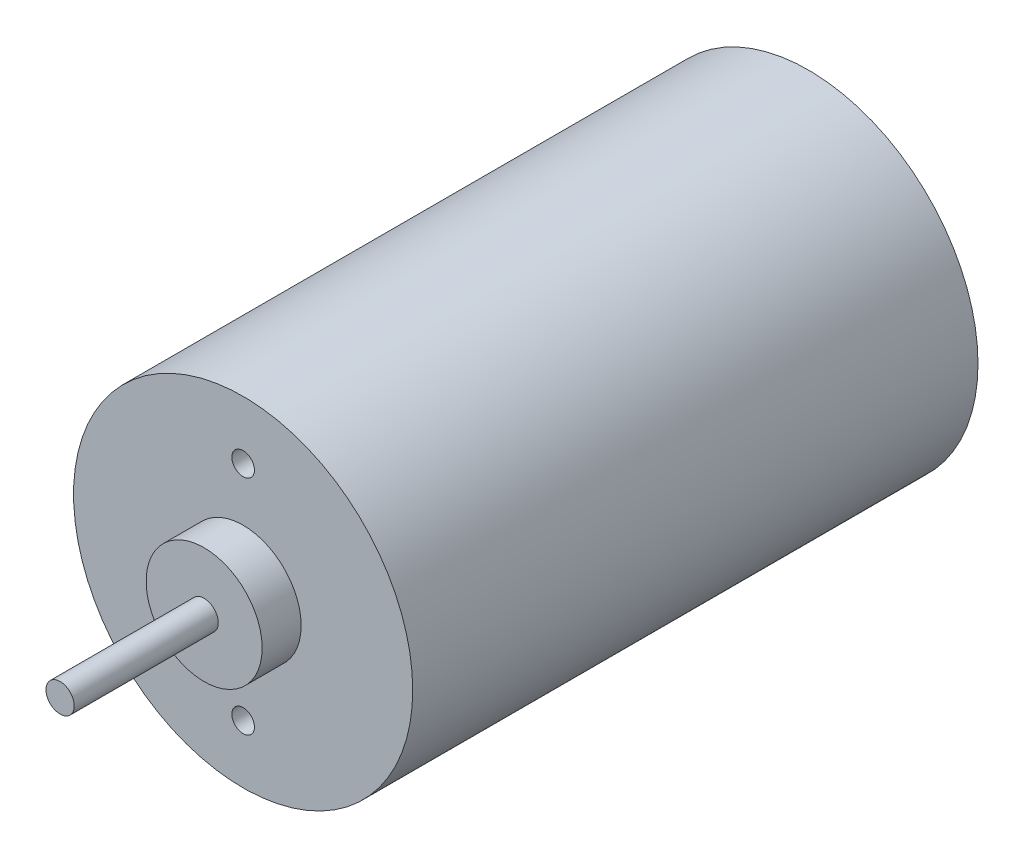
ISO-10303-21;
HEADER;
FILE_DESCRIPTION(('STEP AP214'),'2;1');
FILE_NAME('part.step','',(''),(''),'','','');
FILE_SCHEMA(('AUTOMOTIVE_DESIGN { 1 0 10303 214 1 1 1 1 }'));
ENDSEC;
DATA;
#1=APPLICATION_CONTEXT('core data for automotive mechanical design processes');
#2=APPLICATION_PROTOCOL_DEFINITION('international standard','automotive_design',2000,#1);
#3=PRODUCT_CONTEXT('',#1,'mechanical');
#4=PRODUCT('Part','Part','',(#3));
#5=PRODUCT_RELATED_PRODUCT_CATEGORY('part','',(#4));
#6=PRODUCT_DEFINITION_FORMATION('','',#4);
#7=PRODUCT_DEFINITION_CONTEXT('part definition',#1,'design');
#8=PRODUCT_DEFINITION('design','',#6,#7);
#9=PRODUCT_DEFINITION_SHAPE('','',#8);
#10=(LENGTH_UNIT() NAMED_UNIT(*) SI_UNIT(.MILLI.,.METRE.));
#11=(NAMED_UNIT(*) PLANE_ANGLE_UNIT() SI_UNIT($,.RADIAN.));
#12=(NAMED_UNIT(*) SI_UNIT($,.STERADIAN.) SOLID_ANGLE_UNIT());
#13=UNCERTAINTY_MEASURE_WITH_UNIT(LENGTH_MEASURE(1.E-05),#10,'distance_accuracy_value','');
#14=(GEOMETRIC_REPRESENTATION_CONTEXT(3) GLOBAL_UNCERTAINTY_ASSIGNED_CONTEXT((#13)) GLOBAL_UNIT_ASSIGNED_CONTEXT((#10,
#11,#12)) REPRESENTATION_CONTEXT('',''));
#15=CARTESIAN_POINT('',(0.,0.,0.));
#16=DIRECTION('',(0.,0.,1.));
#17=DIRECTION('',(1.,0.,0.));
#18=AXIS2_PLACEMENT_3D('',#15,#16,#17);
#19=CARTESIAN_POINT('',(0.,0.,67.8815));
#20=DIRECTION('',(0.,0.,1.));
#21=DIRECTION('',(1.,0.,0.));
#22=AXIS2_PLACEMENT_3D('',#19,#20,#21);
#23=PLANE('',#22);
#24=CARTESIAN_POINT('',(0.,0.,67.8815));
#25=DIRECTION('',(0.,0.,1.));
#26=DIRECTION('',(1.,0.,0.));
#27=AXIS2_PLACEMENT_3D('',#24,#25,#26);
#28=CIRCLE('',#27,6.5151);
#29=CARTESIAN_POINT('',(6.5151,0.,67.8815));
#30=VERTEX_POINT('',#29);
#31=EDGE_CURVE('E41',#30,#30,#28,.T.);
#32=ORIENTED_EDGE('',*,*,#31,.T.);
#33=EDGE_LOOP('',(#32));
#34=FACE_BOUND('',#33,.T.);
#35=CARTESIAN_POINT('',(0.,0.,67.8815));
#36=DIRECTION('',(0.,0.,1.));
#37=DIRECTION('',(1.,0.,0.));
#38=AXIS2_PLACEMENT_3D('',#35,#36,#37);
#39=CIRCLE('',#38,1.5875);
#40=CARTESIAN_POINT('',(1.5875,0.,67.8815));
#41=VERTEX_POINT('',#40);
#42=EDGE_CURVE('E49',#41,#41,#39,.T.);
#43=ORIENTED_EDGE('',*,*,#42,.F.);
#44=EDGE_LOOP('',(#43));
#45=FACE_BOUND('',#44,.T.);
#46=ADVANCED_FACE('F30',(#34,#45),#23,.T.);
#47=CARTESIAN_POINT('',(0.,0.,63.5));
#48=DIRECTION('',(0.,0.,1.));
#49=DIRECTION('',(1.,0.,0.));
#50=AXIS2_PLACEMENT_3D('',#47,#48,#49);
#51=PLANE('',#50);
#52=CARTESIAN_POINT('',(0.,-12.5,63.5));
#53=DIRECTION('',(0.,0.,1.));
#54=DIRECTION('',(1.,0.,0.));
#55=AXIS2_PLACEMENT_3D('',#52,#53,#54);
#56=CIRCLE('',#55,1.27);
#57=CARTESIAN_POINT('',(1.27,-12.5,63.5));
#58=VERTEX_POINT('',#57);
#59=EDGE_CURVE('E61',#58,#58,#56,.T.);
#60=ORIENTED_EDGE('',*,*,#59,.F.);
#61=EDGE_LOOP('',(#60));
#62=FACE_BOUND('',#61,.T.);
#63=CARTESIAN_POINT('',(0.,12.5,63.5));
#64=DIRECTION('',(0.,0.,1.));
#65=DIRECTION('',(1.,0.,0.));
#66=AXIS2_PLACEMENT_3D('',#63,#64,#65);
#67=CIRCLE('',#66,1.27);
#68=CARTESIAN_POINT('',(1.27,12.5,63.5));
#69=VERTEX_POINT('',#68);
#70=EDGE_CURVE('E55',#69,#69,#67,.T.);
#71=ORIENTED_EDGE('',*,*,#70,.F.);
#72=EDGE_LOOP('',(#71));
#73=FACE_BOUND('',#72,.T.);
#74=CARTESIAN_POINT('',(0.,0.,63.5));
#75=DIRECTION('',(0.,0.,1.));
#76=DIRECTION('',(1.,0.,0.));
#77=AXIS2_PLACEMENT_3D('',#74,#75,#76);
#78=CIRCLE('',#77,19.05);
#79=CARTESIAN_POINT('',(19.05,0.,63.5));
#80=VERTEX_POINT('',#79);
#81=EDGE_CURVE('E10',#80,#80,#78,.T.);
#82=ORIENTED_EDGE('',*,*,#81,.T.);
#83=EDGE_LOOP('',(#82));
#84=FACE_BOUND('',#83,.T.);
#85=CARTESIAN_POINT('',(0.,0.,63.5));
#86=DIRECTION('',(0.,0.,1.));
#87=DIRECTION('',(1.,0.,0.));
#88=AXIS2_PLACEMENT_3D('',#85,#86,#87);
#89=CIRCLE('',#88,6.5151);
#90=CARTESIAN_POINT('',(6.5151,0.,63.5));
#91=VERTEX_POINT('',#90);
#92=EDGE_CURVE('E43',#91,#91,#89,.T.);
#93=ORIENTED_EDGE('',*,*,#92,.F.);
#94=EDGE_LOOP('',(#93));
#95=FACE_BOUND('',#94,.T.);
#96=ADVANCED_FACE('F76',(#62,#73,#84,#95),#51,.T.);
#97=CARTESIAN_POINT('',(0.,0.,63.5));
#98=DIRECTION('',(0.,0.,-1.));
#99=DIRECTION('',(-1.,0.,0.));
#100=AXIS2_PLACEMENT_3D('',#97,#98,#99);
#101=CYLINDRICAL_SURFACE('',#100,19.05);
#102=ORIENTED_EDGE('',*,*,#81,.F.);
#103=EDGE_LOOP('',(#102));
#104=FACE_BOUND('',#103,.T.);
#105=CARTESIAN_POINT('',(0.,0.,0.));
#106=DIRECTION('',(0.,0.,1.));
#107=DIRECTION('',(1.,0.,0.));
#108=AXIS2_PLACEMENT_3D('',#105,#106,#107);
#109=CIRCLE('',#108,19.05);
#110=CARTESIAN_POINT('',(19.05,0.,0.));
#111=VERTEX_POINT('',#110);
#112=EDGE_CURVE('E34',#111,#111,#109,.T.);
#113=ORIENTED_EDGE('',*,*,#112,.T.);
#114=EDGE_LOOP('',(#113));
#115=FACE_BOUND('',#114,.T.);
#116=ADVANCED_FACE('F32',(#104,#115),#101,.T.);
#117=CARTESIAN_POINT('',(0.,0.,0.));
#118=DIRECTION('',(0.,0.,1.));
#119=DIRECTION('',(1.,0.,0.));
#120=AXIS2_PLACEMENT_3D('',#117,#118,#119);
#121=PLANE('',#120);
#122=ORIENTED_EDGE('',*,*,#112,.F.);
#123=EDGE_LOOP('',(#122));
#124=FACE_BOUND('',#123,.T.);
#125=ADVANCED_FACE('F87',(#124),#121,.F.);
#126=CARTESIAN_POINT('',(0.,0.,67.8815));
#127=DIRECTION('',(0.,0.,-1.));
#128=DIRECTION('',(-1.,0.,0.));
#129=AXIS2_PLACEMENT_3D('',#126,#127,#128);
#130=CYLINDRICAL_SURFACE('',#129,6.5151);
#131=ORIENTED_EDGE('',*,*,#31,.F.);
#132=EDGE_LOOP('',(#131));
#133=FACE_BOUND('',#132,.T.);
#134=ORIENTED_EDGE('',*,*,#92,.T.);
#135=EDGE_LOOP('',(#134));
#136=FACE_BOUND('',#135,.T.);
#137=ADVANCED_FACE('F84',(#133,#136),#130,.T.);
#138=CARTESIAN_POINT('',(0.,0.,84.0613));
#139=DIRECTION('',(0.,0.,-1.));
#140=DIRECTION('',(-1.,0.,0.));
#141=AXIS2_PLACEMENT_3D('',#138,#139,#140);
#142=CYLINDRICAL_SURFACE('',#141,1.5875);
#143=CARTESIAN_POINT('',(0.,0.,84.0613));
#144=DIRECTION('',(0.,0.,1.));
#145=DIRECTION('',(1.,0.,0.));
#146=AXIS2_PLACEMENT_3D('',#143,#144,#145);
#147=CIRCLE('',#146,1.5875);
#148=CARTESIAN_POINT('',(1.5875,0.,84.0613));
#149=VERTEX_POINT('',#148);
#150=EDGE_CURVE('E46',#149,#149,#147,.T.);
#151=ORIENTED_EDGE('',*,*,#150,.F.);
#152=EDGE_LOOP('',(#151));
#153=FACE_BOUND('',#152,.T.);
#154=ORIENTED_EDGE('',*,*,#42,.T.);
#155=EDGE_LOOP('',(#154));
#156=FACE_BOUND('',#155,.T.);
#157=ADVANCED_FACE('F86',(#153,#156),#142,.T.);
#158=CARTESIAN_POINT('',(0.,0.,84.0613));
#159=DIRECTION('',(0.,0.,1.));
#160=DIRECTION('',(1.,0.,0.));
#161=AXIS2_PLACEMENT_3D('',#158,#159,#160);
#162=PLANE('',#161);
#163=ORIENTED_EDGE('',*,*,#150,.T.);
#164=EDGE_LOOP('',(#163));
#165=FACE_BOUND('',#164,.T.);
#166=ADVANCED_FACE('F94',(#165),#162,.T.);
#167=CARTESIAN_POINT('',(0.,12.5,57.15));
#168=DIRECTION('',(0.,0.,1.));
#169=DIRECTION('',(1.,0.,0.));
#170=AXIS2_PLACEMENT_3D('',#167,#168,#169);
#171=CYLINDRICAL_SURFACE('',#170,1.27);
#172=CARTESIAN_POINT('',(0.,12.5,57.15));
#173=DIRECTION('',(0.,0.,1.));
#174=DIRECTION('',(1.,0.,0.));
#175=AXIS2_PLACEMENT_3D('',#172,#173,#174);
#176=CIRCLE('',#175,1.27);
#177=CARTESIAN_POINT('',(1.27,12.5,57.15));
#178=VERTEX_POINT('',#177);
#179=EDGE_CURVE('E52',#178,#178,#176,.T.);
#180=ORIENTED_EDGE('',*,*,#179,.F.);
#181=EDGE_LOOP('',(#180));
#182=FACE_BOUND('',#181,.T.);
#183=ORIENTED_EDGE('',*,*,#70,.T.);
#184=EDGE_LOOP('',(#183));
#185=FACE_BOUND('',#184,.T.);
#186=ADVANCED_FACE('F108',(#182,#185),#171,.F.);
#187=CARTESIAN_POINT('',(0.,12.5,57.15));
#188=DIRECTION('',(0.,0.,1.));
#189=DIRECTION('',(1.,0.,0.));
#190=AXIS2_PLACEMENT_3D('',#187,#188,#189);
#191=PLANE('',#190);
#192=ORIENTED_EDGE('',*,*,#179,.T.);
#193=EDGE_LOOP('',(#192));
#194=FACE_BOUND('',#193,.T.);
#195=ADVANCED_FACE('F72',(#194),#191,.T.);
#196=CARTESIAN_POINT('',(0.,-12.5,57.15));
#197=DIRECTION('',(0.,0.,1.));
#198=DIRECTION('',(1.,0.,0.));
#199=AXIS2_PLACEMENT_3D('',#196,#197,#198);
#200=CYLINDRICAL_SURFACE('',#199,1.27);
#201=CARTESIAN_POINT('',(0.,-12.5,57.15));
#202=DIRECTION('',(0.,0.,1.));
#203=DIRECTION('',(1.,0.,0.));
#204=AXIS2_PLACEMENT_3D('',#201,#202,#203);
#205=CIRCLE('',#204,1.27);
#206=CARTESIAN_POINT('',(1.27,-12.5,57.15));
#207=VERTEX_POINT('',#206);
#208=EDGE_CURVE('E58',#207,#207,#205,.T.);
#209=ORIENTED_EDGE('',*,*,#208,.F.);
#210=EDGE_LOOP('',(#209));
#211=FACE_BOUND('',#210,.T.);
#212=ORIENTED_EDGE('',*,*,#59,.T.);
#213=EDGE_LOOP('',(#212));
#214=FACE_BOUND('',#213,.T.);
#215=ADVANCED_FACE('F69',(#211,#214),#200,.F.);
#216=CARTESIAN_POINT('',(0.,-12.5,57.15));
#217=DIRECTION('',(0.,0.,1.));
#218=DIRECTION('',(1.,0.,0.));
#219=AXIS2_PLACEMENT_3D('',#216,#217,#218);
#220=PLANE('',#219);
#221=ORIENTED_EDGE('',*,*,#208,.T.);
#222=EDGE_LOOP('',(#221));
#223=FACE_BOUND('',#222,.T.);
#224=ADVANCED_FACE('F67',(#223),#220,.T.);
#225=CLOSED_SHELL('',(#46,#96,#116,#125,#137,#157,#166,#186,#195,#215,#224));
#226=MANIFOLD_SOLID_BREP('B2',#225);
#227=ADVANCED_BREP_SHAPE_REPRESENTATION('',(#18,#226),#14);
#228=SHAPE_DEFINITION_REPRESENTATION(#9,#227);
ENDSEC;
END-ISO-10303-21;
